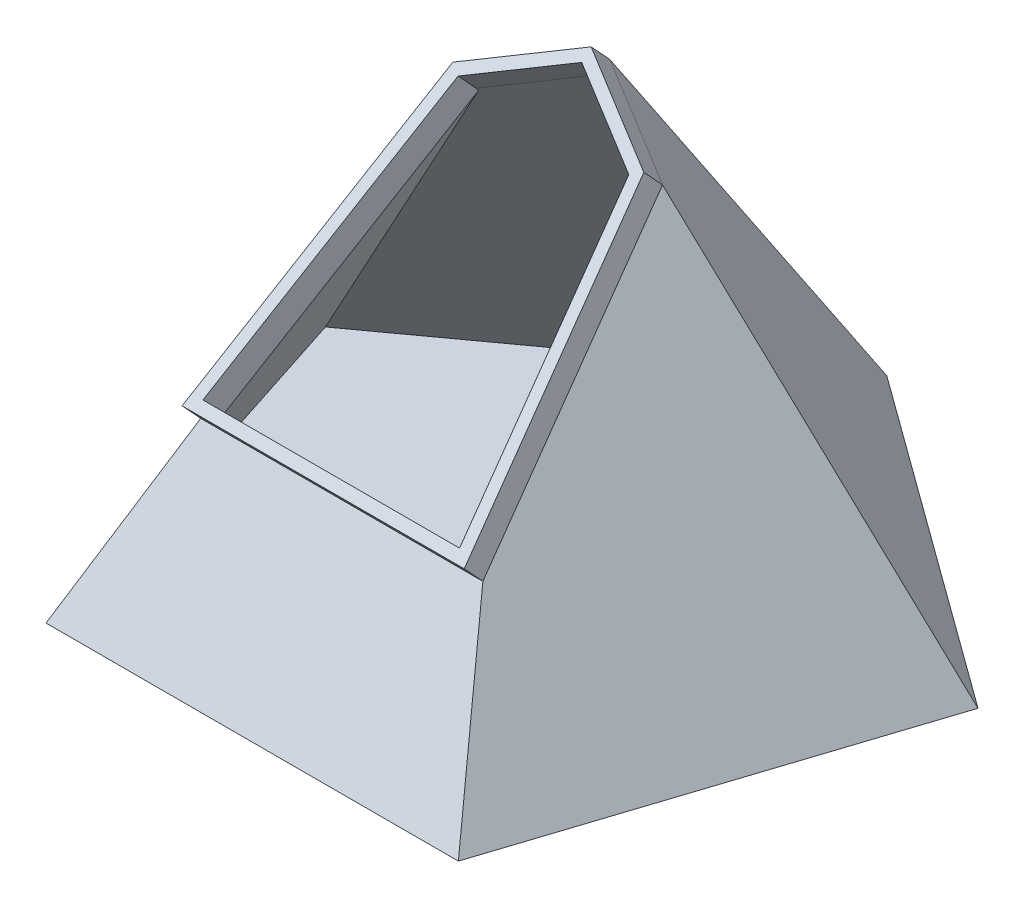
ISO-10303-21;
HEADER;
FILE_DESCRIPTION(('STEP AP214'),'2;1');
FILE_NAME('part.step','',(''),(''),'','','');
FILE_SCHEMA(('AUTOMOTIVE_DESIGN { 1 0 10303 214 1 1 1 1 }'));
ENDSEC;
DATA;
#1=APPLICATION_CONTEXT('core data for automotive mechanical design processes');
#2=APPLICATION_PROTOCOL_DEFINITION('international standard','automotive_design',2000,#1);
#3=PRODUCT_CONTEXT('',#1,'mechanical');
#4=PRODUCT('Part','Part','',(#3));
#5=PRODUCT_RELATED_PRODUCT_CATEGORY('part','',(#4));
#6=PRODUCT_DEFINITION_FORMATION('','',#4);
#7=PRODUCT_DEFINITION_CONTEXT('part definition',#1,'design');
#8=PRODUCT_DEFINITION('design','',#6,#7);
#9=PRODUCT_DEFINITION_SHAPE('','',#8);
#10=(LENGTH_UNIT() NAMED_UNIT(*) SI_UNIT(.MILLI.,.METRE.));
#11=(NAMED_UNIT(*) PLANE_ANGLE_UNIT() SI_UNIT($,.RADIAN.));
#12=(NAMED_UNIT(*) SI_UNIT($,.STERADIAN.) SOLID_ANGLE_UNIT());
#13=UNCERTAINTY_MEASURE_WITH_UNIT(LENGTH_MEASURE(1.E-05),#10,'distance_accuracy_value','');
#14=(GEOMETRIC_REPRESENTATION_CONTEXT(3) GLOBAL_UNCERTAINTY_ASSIGNED_CONTEXT((#13)) GLOBAL_UNIT_ASSIGNED_CONTEXT((#10,
#11,#12)) REPRESENTATION_CONTEXT('',''));
#15=CARTESIAN_POINT('',(0.,0.,0.));
#16=DIRECTION('',(0.,0.,1.));
#17=DIRECTION('',(1.,0.,0.));
#18=AXIS2_PLACEMENT_3D('',#15,#16,#17);
#19=CARTESIAN_POINT('',(0.,0.,0.));
#20=DIRECTION('',(0.,1.,0.));
#21=DIRECTION('',(0.,0.,1.));
#22=AXIS2_PLACEMENT_3D('',#19,#20,#21);
#23=PLANE('',#22);
#24=DIRECTION('',(1.,0.,0.));
#25=VECTOR('',#24,1.);
#26=CARTESIAN_POINT('',(-37.5,0.,51.614322017669));
#27=LINE('',#26,#25);
#28=CARTESIAN_POINT('',(-37.5,0.,51.614322017669));
#29=VERTEX_POINT('',#28);
#30=CARTESIAN_POINT('',(37.5,0.,51.614322017669));
#31=VERTEX_POINT('',#30);
#32=EDGE_CURVE('E285',#29,#31,#27,.T.);
#33=ORIENTED_EDGE('',*,*,#32,.F.);
#34=DIRECTION('',(0.309016994374948,0.,0.951056516295153));
#35=VECTOR('',#34,1.);
#36=CARTESIAN_POINT('',(-60.6762745781211,0.,-19.7149167044675));
#37=LINE('',#36,#35);
#38=CARTESIAN_POINT('',(-60.6762745781211,0.,-19.7149167044675));
#39=VERTEX_POINT('',#38);
#40=EDGE_CURVE('E290',#39,#29,#37,.T.);
#41=ORIENTED_EDGE('',*,*,#40,.F.);
#42=DIRECTION('',(-0.809016994374947,0.,0.587785252292474));
#43=VECTOR('',#42,1.);
#44=CARTESIAN_POINT('',(0.,0.,-63.798810626403));
#45=LINE('',#44,#43);
#46=CARTESIAN_POINT('',(0.,0.,-63.798810626403));
#47=VERTEX_POINT('',#46);
#48=EDGE_CURVE('E346',#47,#39,#45,.T.);
#49=ORIENTED_EDGE('',*,*,#48,.F.);
#50=DIRECTION('',(-0.809016994374948,0.,-0.587785252292473));
#51=VECTOR('',#50,1.);
#52=CARTESIAN_POINT('',(60.6762745781211,0.,-19.7149167044675));
#53=LINE('',#52,#51);
#54=CARTESIAN_POINT('',(60.6762745781211,0.,-19.7149167044675));
#55=VERTEX_POINT('',#54);
#56=EDGE_CURVE('E349',#55,#47,#53,.T.);
#57=ORIENTED_EDGE('',*,*,#56,.F.);
#58=DIRECTION('',(0.309016994374948,0.,-0.951056516295154));
#59=VECTOR('',#58,1.);
#60=CARTESIAN_POINT('',(37.5,0.,51.614322017669));
#61=LINE('',#60,#59);
#62=EDGE_CURVE('E366',#31,#55,#61,.T.);
#63=ORIENTED_EDGE('',*,*,#62,.F.);
#64=EDGE_LOOP('',(#33,#41,#49,#57,#63));
#65=FACE_BOUND('',#64,.T.);
#66=ADVANCED_FACE('F46',(#65),#23,.F.);
#67=CARTESIAN_POINT('',(0.,21.6513649291611,39.850948106345));
#68=DIRECTION('',(0.,0.477398266144197,0.878687029312778));
#69=DIRECTION('',(0.,-0.878687029312778,0.477398266144197));
#70=AXIS2_PLACEMENT_3D('',#67,#68,#69);
#71=PLANE('',#70);
#72=DIRECTION('',(1.,0.,0.));
#73=VECTOR('',#72,1.);
#74=CARTESIAN_POINT('',(-50.,30.,35.315062433142));
#75=LINE('',#74,#73);
#76=CARTESIAN_POINT('',(-25.6578947368421,30.,35.315062433142));
#77=VERTEX_POINT('',#76);
#78=CARTESIAN_POINT('',(25.6578947368421,30.,35.3150624331419));
#79=VERTEX_POINT('',#78);
#80=EDGE_CURVE('E269',#77,#79,#75,.T.);
#81=ORIENTED_EDGE('',*,*,#80,.F.);
#82=DIRECTION('',(-0.327697959181855,-0.8301681632607,0.451037546393206));
#83=VECTOR('',#82,1.);
#84=CARTESIAN_POINT('',(0.,95.,0.));
#85=LINE('',#84,#83);
#86=EDGE_CURVE('E338',#77,#29,#85,.T.);
#87=ORIENTED_EDGE('',*,*,#86,.T.);
#88=ORIENTED_EDGE('',*,*,#32,.T.);
#89=DIRECTION('',(0.327697959181855,-0.8301681632607,0.451037546393206));
#90=VECTOR('',#89,1.);
#91=CARTESIAN_POINT('',(0.,95.,0.));
#92=LINE('',#91,#90);
#93=EDGE_CURVE('E51',#79,#31,#92,.T.);
#94=ORIENTED_EDGE('',*,*,#93,.F.);
#95=EDGE_LOOP('',(#81,#87,#88,#94));
#96=FACE_BOUND('',#95,.T.);
#97=ADVANCED_FACE('F381',(#96),#71,.T.);
#98=CARTESIAN_POINT('',(37.9005038770794,21.6513649291611,12.3146202068147));
#99=DIRECTION('',(0.835681025011948,0.477398266144197,0.271529224794486));
#100=DIRECTION('',(-0.496034173352985,0.868302999456999,0.));
#101=AXIS2_PLACEMENT_3D('',#98,#99,#100);
#102=PLANE('',#101);
#103=DIRECTION('',(-0.147132683830162,0.670925038265538,-0.726781649725225));
#104=VECTOR('',#103,1.);
#105=CARTESIAN_POINT('',(24.2875446031351,36.2487966097043,28.5460339280515));
#106=LINE('',#105,#104);
#107=CARTESIAN_POINT('',(17.3662487703551,67.8099056071806,-5.64263627516887));
#108=VERTEX_POINT('',#107);
#109=EDGE_CURVE('E281',#79,#108,#106,.T.);
#110=ORIENTED_EDGE('',*,*,#109,.F.);
#111=ORIENTED_EDGE('',*,*,#93,.T.);
#112=ORIENTED_EDGE('',*,*,#62,.T.);
#113=DIRECTION('',(0.530226436000217,-0.8301681632607,-0.172281012519847));
#114=VECTOR('',#113,1.);
#115=CARTESIAN_POINT('',(0.,95.,0.));
#116=LINE('',#115,#114);
#117=EDGE_CURVE('E58',#108,#55,#116,.T.);
#118=ORIENTED_EDGE('',*,*,#117,.F.);
#119=EDGE_LOOP('',(#110,#111,#112,#118));
#120=FACE_BOUND('',#119,.T.);
#121=ADVANCED_FACE('F308',(#120),#102,.T.);
#122=CARTESIAN_POINT('',(-37.9005038770794,21.6513649291611,12.3146202068147));
#123=DIRECTION('',(-0.835681025011948,0.477398266144197,0.271529224794486));
#124=DIRECTION('',(-0.496034173352985,-0.868302999456999,0.));
#125=AXIS2_PLACEMENT_3D('',#122,#123,#124);
#126=PLANE('',#125);
#127=DIRECTION('',(-0.147132683830162,-0.670925038265538,0.726781649725225));
#128=VECTOR('',#127,1.);
#129=CARTESIAN_POINT('',(-24.287544603135,36.2487966097043,28.5460339280515));
#130=LINE('',#129,#128);
#131=CARTESIAN_POINT('',(-17.3662487703551,67.8099056071806,-5.64263627516887));
#132=VERTEX_POINT('',#131);
#133=EDGE_CURVE('E277',#132,#77,#130,.T.);
#134=ORIENTED_EDGE('',*,*,#133,.F.);
#135=DIRECTION('',(-0.530226436000217,-0.8301681632607,-0.172281012519847));
#136=VECTOR('',#135,1.);
#137=CARTESIAN_POINT('',(0.,95.,0.));
#138=LINE('',#137,#136);
#139=EDGE_CURVE('E333',#132,#39,#138,.T.);
#140=ORIENTED_EDGE('',*,*,#139,.T.);
#141=ORIENTED_EDGE('',*,*,#40,.T.);
#142=ORIENTED_EDGE('',*,*,#86,.F.);
#143=EDGE_LOOP('',(#134,#140,#141,#142));
#144=FACE_BOUND('',#143,.T.);
#145=ADVANCED_FACE('F298',(#144),#126,.T.);
#146=CARTESIAN_POINT('',(-23.4237995867822,21.6513649291611,-32.2400942599872));
#147=DIRECTION('',(-0.516479277210735,0.477398266144197,-0.710872739450875));
#148=DIRECTION('',(-0.809016994374947,0.,0.587785252292474));
#149=AXIS2_PLACEMENT_3D('',#146,#147,#148);
#150=PLANE('',#149);
#151=DIRECTION('',(-0.853558395699013,-0.35339614881803,0.38281748540566));
#152=VECTOR('',#151,1.);
#153=CARTESIAN_POINT('',(-27.0121004182079,63.816263412812,-1.31651085594315));
#154=LINE('',#153,#152);
#155=CARTESIAN_POINT('',(0.,75.,-13.4313285529269));
#156=VERTEX_POINT('',#155);
#157=EDGE_CURVE('E273',#156,#132,#154,.T.);
#158=ORIENTED_EDGE('',*,*,#157,.F.);
#159=DIRECTION('',(0.,-0.8301681632607,-0.557513067746718));
#160=VECTOR('',#159,1.);
#161=CARTESIAN_POINT('',(0.,95.,0.));
#162=LINE('',#161,#160);
#163=EDGE_CURVE('E330',#156,#47,#162,.T.);
#164=ORIENTED_EDGE('',*,*,#163,.T.);
#165=ORIENTED_EDGE('',*,*,#48,.T.);
#166=ORIENTED_EDGE('',*,*,#139,.F.);
#167=EDGE_LOOP('',(#158,#164,#165,#166));
#168=FACE_BOUND('',#167,.T.);
#169=ADVANCED_FACE('F307',(#168),#150,.T.);
#170=CARTESIAN_POINT('',(23.4237995867822,21.6513649291611,-32.2400942599872));
#171=DIRECTION('',(0.516479277210735,0.477398266144197,-0.710872739450875));
#172=DIRECTION('',(-0.809016994374948,0.,-0.587785252292473));
#173=AXIS2_PLACEMENT_3D('',#170,#171,#172);
#174=PLANE('',#173);
#175=DIRECTION('',(-0.853558395699013,0.35339614881803,-0.382817485405659));
#176=VECTOR('',#175,1.);
#177=CARTESIAN_POINT('',(27.0121004182078,63.816263412812,-1.31651085594317));
#178=LINE('',#177,#176);
#179=EDGE_CURVE('E12',#108,#156,#178,.T.);
#180=ORIENTED_EDGE('',*,*,#179,.F.);
#181=ORIENTED_EDGE('',*,*,#117,.T.);
#182=ORIENTED_EDGE('',*,*,#56,.T.);
#183=ORIENTED_EDGE('',*,*,#163,.F.);
#184=EDGE_LOOP('',(#180,#181,#182,#183));
#185=FACE_BOUND('',#184,.T.);
#186=ADVANCED_FACE('F48',(#185),#174,.T.);
#187=CARTESIAN_POINT('',(-25.6578947368421,33.673892082224,38.7065985111119));
#188=DIRECTION('',(0.,0.678307215593986,-0.734778416444804));
#189=DIRECTION('',(0.,0.734778416444804,0.678307215593986));
#190=AXIS2_PLACEMENT_3D('',#187,#188,#189);
#191=PLANE('',#190);
#192=ORIENTED_EDGE('',*,*,#80,.T.);
#193=DIRECTION('',(0.,-0.734778416444804,-0.678307215593986));
#194=VECTOR('',#193,1.);
#195=CARTESIAN_POINT('',(25.6578947368421,33.673892082224,38.7065985111119));
#196=LINE('',#195,#194);
#197=CARTESIAN_POINT('',(25.6578947368421,33.673892082224,38.7065985111119));
#198=VERTEX_POINT('',#197);
#199=EDGE_CURVE('E265',#198,#79,#196,.T.);
#200=ORIENTED_EDGE('',*,*,#199,.F.);
#201=DIRECTION('',(1.,0.,0.));
#202=VECTOR('',#201,1.);
#203=CARTESIAN_POINT('',(-25.6578947368421,33.673892082224,38.7065985111119));
#204=LINE('',#203,#202);
#205=CARTESIAN_POINT('',(-25.6578947368421,33.673892082224,38.7065985111119));
#206=VERTEX_POINT('',#205);
#207=EDGE_CURVE('E217',#206,#198,#204,.T.);
#208=ORIENTED_EDGE('',*,*,#207,.F.);
#209=DIRECTION('',(0.,-0.734778416444804,-0.678307215593986));
#210=VECTOR('',#209,1.);
#211=CARTESIAN_POINT('',(-25.6578947368421,33.673892082224,38.7065985111119));
#212=LINE('',#211,#210);
#213=EDGE_CURVE('E249',#206,#77,#212,.T.);
#214=ORIENTED_EDGE('',*,*,#213,.T.);
#215=EDGE_LOOP('',(#192,#200,#208,#214));
#216=FACE_BOUND('',#215,.T.);
#217=ADVANCED_FACE('F382',(#216),#191,.F.);
#218=CARTESIAN_POINT('',(25.6578947368421,33.673892082224,38.7065985111119));
#219=DIRECTION('',(-0.989116764264429,-0.0998011610917075,0.108109920432));
#220=DIRECTION('',(0.10865237817571,0.,0.994079806009941));
#221=AXIS2_PLACEMENT_3D('',#218,#219,#220);
#222=PLANE('',#221);
#223=ORIENTED_EDGE('',*,*,#109,.T.);
#224=DIRECTION('',(0.,-0.734778416444804,-0.678307215593986));
#225=VECTOR('',#224,1.);
#226=CARTESIAN_POINT('',(17.3662487703551,71.4837976894047,-2.25110019719893));
#227=LINE('',#226,#225);
#228=CARTESIAN_POINT('',(17.3662487703551,71.4837976894047,-2.25110019719893));
#229=VERTEX_POINT('',#228);
#230=EDGE_CURVE('E261',#229,#108,#227,.T.);
#231=ORIENTED_EDGE('',*,*,#230,.F.);
#232=DIRECTION('',(-0.147132683830162,0.670925038265538,-0.726781649725225));
#233=VECTOR('',#232,1.);
#234=CARTESIAN_POINT('',(25.6578947368421,33.673892082224,38.7065985111119));
#235=LINE('',#234,#233);
#236=EDGE_CURVE('E237',#198,#229,#235,.T.);
#237=ORIENTED_EDGE('',*,*,#236,.F.);
#238=ORIENTED_EDGE('',*,*,#199,.T.);
#239=EDGE_LOOP('',(#223,#231,#237,#238));
#240=FACE_BOUND('',#239,.T.);
#241=ADVANCED_FACE('F431',(#240),#222,.F.);
#242=CARTESIAN_POINT('',(17.3662487703551,71.4837976894047,-2.25110019719893));
#243=DIRECTION('',(-0.520997183420148,-0.578974818733467,0.627176286334888));
#244=DIRECTION('',(0.,-0.734778416444804,-0.678307215593986));
#245=AXIS2_PLACEMENT_3D('',#242,#243,#244);
#246=PLANE('',#245);
#247=ORIENTED_EDGE('',*,*,#179,.T.);
#248=DIRECTION('',(0.,-0.734778416444804,-0.678307215593986));
#249=VECTOR('',#248,1.);
#250=CARTESIAN_POINT('',(0.,78.673892082224,-10.039792474957));
#251=LINE('',#250,#249);
#252=CARTESIAN_POINT('',(0.,78.673892082224,-10.039792474957));
#253=VERTEX_POINT('',#252);
#254=EDGE_CURVE('E257',#253,#156,#251,.T.);
#255=ORIENTED_EDGE('',*,*,#254,.F.);
#256=DIRECTION('',(-0.853558395699013,0.35339614881803,-0.382817485405659));
#257=VECTOR('',#256,1.);
#258=CARTESIAN_POINT('',(17.3662487703551,71.4837976894047,-2.25110019719893));
#259=LINE('',#258,#257);
#260=EDGE_CURVE('E240',#229,#253,#259,.T.);
#261=ORIENTED_EDGE('',*,*,#260,.F.);
#262=ORIENTED_EDGE('',*,*,#230,.T.);
#263=EDGE_LOOP('',(#247,#255,#261,#262));
#264=FACE_BOUND('',#263,.T.);
#265=ADVANCED_FACE('F447',(#264),#246,.F.);
#266=CARTESIAN_POINT('',(0.,78.673892082224,-10.039792474957));
#267=DIRECTION('',(0.520997183420148,-0.578974818733467,0.627176286334888));
#268=DIRECTION('',(0.,-0.734778416444804,-0.678307215593986));
#269=AXIS2_PLACEMENT_3D('',#266,#267,#268);
#270=PLANE('',#269);
#271=ORIENTED_EDGE('',*,*,#157,.T.);
#272=DIRECTION('',(0.,-0.734778416444804,-0.678307215593986));
#273=VECTOR('',#272,1.);
#274=CARTESIAN_POINT('',(-17.3662487703551,71.4837976894047,-2.25110019719893));
#275=LINE('',#274,#273);
#276=CARTESIAN_POINT('',(-17.3662487703551,71.4837976894047,-2.25110019719893));
#277=VERTEX_POINT('',#276);
#278=EDGE_CURVE('E253',#277,#132,#275,.T.);
#279=ORIENTED_EDGE('',*,*,#278,.F.);
#280=DIRECTION('',(-0.853558395699013,-0.35339614881803,0.382817485405659));
#281=VECTOR('',#280,1.);
#282=CARTESIAN_POINT('',(0.,78.673892082224,-10.039792474957));
#283=LINE('',#282,#281);
#284=EDGE_CURVE('E243',#253,#277,#283,.T.);
#285=ORIENTED_EDGE('',*,*,#284,.F.);
#286=ORIENTED_EDGE('',*,*,#254,.T.);
#287=EDGE_LOOP('',(#271,#279,#285,#286));
#288=FACE_BOUND('',#287,.T.);
#289=ADVANCED_FACE('F442',(#288),#270,.F.);
#290=CARTESIAN_POINT('',(-17.3662487703551,71.4837976894047,-2.25110019719893));
#291=DIRECTION('',(0.989116764264429,-0.0998011610917073,0.108109920432));
#292=DIRECTION('',(0.10865237817571,0.,-0.994079806009941));
#293=AXIS2_PLACEMENT_3D('',#290,#291,#292);
#294=PLANE('',#293);
#295=ORIENTED_EDGE('',*,*,#133,.T.);
#296=ORIENTED_EDGE('',*,*,#213,.F.);
#297=DIRECTION('',(-0.147132683830162,-0.670925038265538,0.726781649725225));
#298=VECTOR('',#297,1.);
#299=CARTESIAN_POINT('',(-17.3662487703551,71.4837976894047,-2.25110019719893));
#300=LINE('',#299,#298);
#301=EDGE_CURVE('E246',#277,#206,#300,.T.);
#302=ORIENTED_EDGE('',*,*,#301,.F.);
#303=ORIENTED_EDGE('',*,*,#278,.T.);
#304=EDGE_LOOP('',(#295,#296,#302,#303));
#305=FACE_BOUND('',#304,.T.);
#306=ADVANCED_FACE('F438',(#305),#294,.F.);
#307=CARTESIAN_POINT('',(0.,37.4720931312899,34.5921853248572));
#308=DIRECTION('',(0.,0.734778416444804,0.678307215593986));
#309=DIRECTION('',(0.,-0.678307215593986,0.734778416444804));
#310=AXIS2_PLACEMENT_3D('',#307,#308,#309);
#311=PLANE('',#310);
#312=DIRECTION('',(1.,0.,0.));
#313=VECTOR('',#312,1.);
#314=CARTESIAN_POINT('',(-25.6578947368421,35.030506513412,37.2370416782223));
#315=LINE('',#314,#313);
#316=CARTESIAN_POINT('',(-23.3383856045037,35.030506513412,37.2370416782223));
#317=VERTEX_POINT('',#316);
#318=CARTESIAN_POINT('',(23.3383856045038,35.030506513412,37.2370416782223));
#319=VERTEX_POINT('',#318);
#320=EDGE_CURVE('E218',#317,#319,#315,.T.);
#321=ORIENTED_EDGE('',*,*,#320,.F.);
#322=DIRECTION('',(-0.147132683830162,-0.670925038265538,0.726781649725225));
#323=VECTOR('',#322,1.);
#324=CARTESIAN_POINT('',(-15.3880152418263,71.2841953672213,-2.03488035633492));
#325=LINE('',#324,#323);
#326=CARTESIAN_POINT('',(-15.5256714909766,70.6564828710959,-1.35490882826903));
#327=VERTEX_POINT('',#326);
#328=EDGE_CURVE('E230',#327,#317,#325,.T.);
#329=ORIENTED_EDGE('',*,*,#328,.F.);
#330=DIRECTION('',(-0.853558395699013,-0.35339614881803,0.382817485405659));
#331=VECTOR('',#330,1.);
#332=CARTESIAN_POINT('',(1.0419943668403,77.5159424447571,-8.78543990228722));
#333=LINE('',#332,#331);
#334=CARTESIAN_POINT('',(0.,77.0845287322484,-8.31810964658282));
#335=VERTEX_POINT('',#334);
#336=EDGE_CURVE('E227',#335,#327,#333,.T.);
#337=ORIENTED_EDGE('',*,*,#336,.F.);
#338=DIRECTION('',(-0.853558395699013,0.35339614881803,-0.382817485405659));
#339=VECTOR('',#338,1.);
#340=CARTESIAN_POINT('',(16.3242544035148,70.3258480519378,-0.996747624529149));
#341=LINE('',#340,#339);
#342=CARTESIAN_POINT('',(15.5256714909766,70.6564828710959,-1.35490882826903));
#343=VERTEX_POINT('',#342);
#344=EDGE_CURVE('E224',#343,#335,#341,.T.);
#345=ORIENTED_EDGE('',*,*,#344,.F.);
#346=DIRECTION('',(-0.147132683830162,0.670925038265538,-0.726781649725225));
#347=VECTOR('',#346,1.);
#348=CARTESIAN_POINT('',(23.6796612083133,33.4742897600406,38.9228183519759));
#349=LINE('',#348,#347);
#350=EDGE_CURVE('E221',#319,#343,#349,.T.);
#351=ORIENTED_EDGE('',*,*,#350,.F.);
#352=EDGE_LOOP('',(#321,#329,#337,#345,#351));
#353=FACE_BOUND('',#352,.T.);
#354=ORIENTED_EDGE('',*,*,#207,.T.);
#355=ORIENTED_EDGE('',*,*,#236,.T.);
#356=ORIENTED_EDGE('',*,*,#260,.T.);
#357=ORIENTED_EDGE('',*,*,#284,.T.);
#358=ORIENTED_EDGE('',*,*,#301,.T.);
#359=EDGE_LOOP('',(#354,#355,#356,#357,#358));
#360=FACE_BOUND('',#359,.T.);
#361=ADVANCED_FACE('F449',(#353,#360),#311,.T.);
#362=CARTESIAN_POINT('',(0.,2.,0.));
#363=DIRECTION('',(0.,1.,0.));
#364=DIRECTION('',(0.,0.,1.));
#365=AXIS2_PLACEMENT_3D('',#362,#363,#364);
#366=PLANE('',#365);
#367=DIRECTION('',(1.,0.,0.));
#368=VECTOR('',#367,1.);
#369=CARTESIAN_POINT('',(0.,2.,48.2515814357358));
#370=LINE('',#369,#368);
#371=CARTESIAN_POINT('',(-35.056825956576,2.,48.2515814357359));
#372=VERTEX_POINT('',#371);
#373=CARTESIAN_POINT('',(35.0568259565761,2.,48.2515814357358));
#374=VERTEX_POINT('',#373);
#375=EDGE_CURVE('E676',#372,#374,#370,.T.);
#376=ORIENTED_EDGE('',*,*,#375,.T.);
#377=DIRECTION('',(0.309016994374948,0.,-0.951056516295154));
#378=VECTOR('',#377,1.);
#379=CARTESIAN_POINT('',(45.8899809460029,2.,14.9105586691091));
#380=LINE('',#379,#378);
#381=CARTESIAN_POINT('',(56.7231359354296,2.,-18.4304640975176));
#382=VERTEX_POINT('',#381);
#383=EDGE_CURVE('E189',#374,#382,#380,.T.);
#384=ORIENTED_EDGE('',*,*,#383,.T.);
#385=DIRECTION('',(-0.809016994374948,0.,-0.587785252292473));
#386=VECTOR('',#385,1.);
#387=CARTESIAN_POINT('',(28.3615679677148,2.,-39.036349386977));
#388=LINE('',#387,#386);
#389=CARTESIAN_POINT('',(0.,2.,-59.6422346764364));
#390=VERTEX_POINT('',#389);
#391=EDGE_CURVE('E681',#382,#390,#388,.T.);
#392=ORIENTED_EDGE('',*,*,#391,.T.);
#393=DIRECTION('',(-0.809016994374947,0.,0.587785252292473));
#394=VECTOR('',#393,1.);
#395=CARTESIAN_POINT('',(-28.3615679677148,2.,-39.036349386977));
#396=LINE('',#395,#394);
#397=CARTESIAN_POINT('',(-56.7231359354296,2.,-18.4304640975176));
#398=VERTEX_POINT('',#397);
#399=EDGE_CURVE('E685',#390,#398,#396,.T.);
#400=ORIENTED_EDGE('',*,*,#399,.T.);
#401=DIRECTION('',(0.309016994374948,0.,0.951056516295154));
#402=VECTOR('',#401,1.);
#403=CARTESIAN_POINT('',(-45.8899809460028,2.,14.9105586691091));
#404=LINE('',#403,#402);
#405=EDGE_CURVE('E647',#398,#372,#404,.T.);
#406=ORIENTED_EDGE('',*,*,#405,.T.);
#407=EDGE_LOOP('',(#376,#384,#392,#400,#406));
#408=FACE_BOUND('',#407,.T.);
#409=ADVANCED_FACE('F451',(#408),#366,.T.);
#410=CARTESIAN_POINT('',(0.,20.6965683968727,38.0935740477194));
#411=DIRECTION('',(0.,0.477398266144197,0.878687029312778));
#412=DIRECTION('',(0.,-0.878687029312778,0.477398266144197));
#413=AXIS2_PLACEMENT_3D('',#410,#411,#412);
#414=PLANE('',#413);
#415=DIRECTION('',(1.,0.,0.));
#416=VECTOR('',#415,1.);
#417=CARTESIAN_POINT('',(-25.6578947368421,30.3039889213192,32.8737793455306));
#418=LINE('',#417,#416);
#419=CARTESIAN_POINT('',(-23.8841987507922,30.3039889213192,32.8737793455306));
#420=VERTEX_POINT('',#419);
#421=CARTESIAN_POINT('',(23.8841987507922,30.3039889213192,32.8737793455306));
#422=VERTEX_POINT('',#421);
#423=EDGE_CURVE('E169',#420,#422,#418,.T.);
#424=ORIENTED_EDGE('',*,*,#423,.T.);
#425=DIRECTION('',(0.327697959181855,-0.8301681632607,0.451037546393206));
#426=VECTOR('',#425,1.);
#427=CARTESIAN_POINT('',(24.7045233670797,28.2258332267243,34.0028593163061));
#428=LINE('',#427,#426);
#429=EDGE_CURVE('E173',#422,#374,#428,.T.);
#430=ORIENTED_EDGE('',*,*,#429,.T.);
#431=ORIENTED_EDGE('',*,*,#375,.F.);
#432=DIRECTION('',(-0.327697959181855,-0.8301681632607,0.451037546393206));
#433=VECTOR('',#432,1.);
#434=CARTESIAN_POINT('',(-24.7045233670796,28.2258332267242,34.0028593163061));
#435=LINE('',#434,#433);
#436=EDGE_CURVE('E175',#420,#372,#435,.T.);
#437=ORIENTED_EDGE('',*,*,#436,.F.);
#438=EDGE_LOOP('',(#424,#430,#431,#437));
#439=FACE_BOUND('',#438,.T.);
#440=ADVANCED_FACE('F171',(#439),#414,.F.);
#441=CARTESIAN_POINT('',(36.2291418270555,20.6965683968727,11.7715617572258));
#442=DIRECTION('',(0.835681025011948,0.477398266144197,0.271529224794486));
#443=DIRECTION('',(-0.496034173352985,0.868302999456999,0.));
#444=AXIS2_PLACEMENT_3D('',#441,#442,#443);
#445=PLANE('',#444);
#446=DIRECTION('',(-0.147132683830162,0.670925038265538,-0.726781649725225));
#447=VECTOR('',#446,1.);
#448=CARTESIAN_POINT('',(23.6796612083133,29.374267512644,35.1379022299685));
#449=LINE('',#448,#447);
#450=CARTESIAN_POINT('',(23.3383856045038,30.9304842660154,33.4521255562149));
#451=VERTEX_POINT('',#450);
#452=CARTESIAN_POINT('',(15.5437601051169,66.4739765432192,-5.05047381167174));
#453=VERTEX_POINT('',#452);
#454=EDGE_CURVE('E643',#451,#453,#449,.T.);
#455=ORIENTED_EDGE('',*,*,#454,.T.);
#456=DIRECTION('',(0.530226436000218,-0.8301681632607,-0.172281012519847));
#457=VECTOR('',#456,1.);
#458=CARTESIAN_POINT('',(39.9727584838009,28.2258332267243,-12.9879365441479));
#459=LINE('',#458,#457);
#460=EDGE_CURVE('E206',#453,#382,#459,.T.);
#461=ORIENTED_EDGE('',*,*,#460,.T.);
#462=ORIENTED_EDGE('',*,*,#383,.F.);
#463=ORIENTED_EDGE('',*,*,#429,.F.);
#464=DIRECTION('',(0.539144006792832,-0.618840371789193,-0.571279558695376));
#465=VECTOR('',#464,1.);
#466=CARTESIAN_POINT('',(6.56262038987827,50.1860461412607,51.2278063165336));
#467=LINE('',#466,#465);
#468=EDGE_CURVE('E186',#451,#422,#467,.T.);
#469=ORIENTED_EDGE('',*,*,#468,.F.);
#470=EDGE_LOOP('',(#455,#461,#462,#463,#469));
#471=FACE_BOUND('',#470,.T.);
#472=ADVANCED_FACE('F185',(#471),#445,.F.);
#473=CARTESIAN_POINT('',(-36.2291418270555,20.6965683968727,11.7715617572258));
#474=DIRECTION('',(-0.835681025011948,0.477398266144197,0.271529224794486));
#475=DIRECTION('',(-0.496034173352985,-0.868302999456999,0.));
#476=AXIS2_PLACEMENT_3D('',#473,#474,#475);
#477=PLANE('',#476);
#478=DIRECTION('',(-0.147132683830162,-0.670925038265538,0.726781649725225));
#479=VECTOR('',#478,1.);
#480=CARTESIAN_POINT('',(-15.3880152418263,67.1841731198246,-5.81979647834235));
#481=LINE('',#480,#479);
#482=CARTESIAN_POINT('',(-15.5437601051169,66.4739765432192,-5.05047381167175));
#483=VERTEX_POINT('',#482);
#484=CARTESIAN_POINT('',(-23.3383856045037,30.9304842660153,33.4521255562149));
#485=VERTEX_POINT('',#484);
#486=EDGE_CURVE('E639',#483,#485,#481,.T.);
#487=ORIENTED_EDGE('',*,*,#486,.T.);
#488=DIRECTION('',(0.539144006792832,0.618840371789193,0.571279558695376));
#489=VECTOR('',#488,1.);
#490=CARTESIAN_POINT('',(-21.4789021561474,33.0648368954027,35.4224430787957));
#491=LINE('',#490,#489);
#492=EDGE_CURVE('E198',#420,#485,#491,.T.);
#493=ORIENTED_EDGE('',*,*,#492,.F.);
#494=ORIENTED_EDGE('',*,*,#436,.T.);
#495=ORIENTED_EDGE('',*,*,#405,.F.);
#496=DIRECTION('',(-0.530226436000217,-0.8301681632607,-0.172281012519847));
#497=VECTOR('',#496,1.);
#498=CARTESIAN_POINT('',(-39.9727584838009,28.2258332267242,-12.9879365441479));
#499=LINE('',#498,#497);
#500=EDGE_CURVE('E192',#483,#398,#499,.T.);
#501=ORIENTED_EDGE('',*,*,#500,.F.);
#502=EDGE_LOOP('',(#487,#493,#494,#495,#501));
#503=FACE_BOUND('',#502,.T.);
#504=ADVANCED_FACE('F559',(#503),#477,.F.);
#505=CARTESIAN_POINT('',(-22.3908410323608,20.6965683968727,-30.8183487810854));
#506=DIRECTION('',(-0.516479277210735,0.477398266144197,-0.710872739450875));
#507=DIRECTION('',(-0.809016994374947,0.,0.587785252292474));
#508=AXIS2_PLACEMENT_3D('',#505,#506,#507);
#509=PLANE('',#508);
#510=DIRECTION('',(-0.853558395699013,-0.353396148818023,0.382817485405665));
#511=VECTOR('',#510,1.);
#512=CARTESIAN_POINT('',(-25.9701060513672,62.7552901324596,0.0273649815645503));
#513=LINE('',#512,#511);
#514=CARTESIAN_POINT('',(0.,73.5076130071387,-11.6201224597148));
#515=VERTEX_POINT('',#514);
#516=CARTESIAN_POINT('',(-15.5256714909766,67.0795671459862,-4.65692164140093));
#517=VERTEX_POINT('',#516);
#518=EDGE_CURVE('E180',#515,#517,#513,.T.);
#519=ORIENTED_EDGE('',*,*,#518,.T.);
#520=DIRECTION('',(0.0250374814852034,0.838232458646168,0.544737982697075));
#521=VECTOR('',#520,1.);
#522=CARTESIAN_POINT('',(-15.4015800267554,71.234038242155,-1.95707605470605));
#523=LINE('',#522,#521);
#524=EDGE_CURVE('E214',#483,#517,#523,.T.);
#525=ORIENTED_EDGE('',*,*,#524,.F.);
#526=ORIENTED_EDGE('',*,*,#500,.T.);
#527=ORIENTED_EDGE('',*,*,#399,.F.);
#528=DIRECTION('',(0.,-0.8301681632607,-0.557513067746718));
#529=VECTOR('',#528,1.);
#530=CARTESIAN_POINT('',(0.,28.2258332267242,-42.0298455443163));
#531=LINE('',#530,#529);
#532=EDGE_CURVE('E651',#515,#390,#531,.T.);
#533=ORIENTED_EDGE('',*,*,#532,.F.);
#534=EDGE_LOOP('',(#519,#525,#526,#527,#533));
#535=FACE_BOUND('',#534,.T.);
#536=ADVANCED_FACE('F567',(#535),#509,.F.);
#537=CARTESIAN_POINT('',(22.3908410323607,20.6965683968727,-30.8183487810854));
#538=DIRECTION('',(0.516479277210735,0.477398266144197,-0.710872739450875));
#539=DIRECTION('',(-0.809016994374948,0.,-0.587785252292473));
#540=AXIS2_PLACEMENT_3D('',#537,#538,#539);
#541=PLANE('',#540);
#542=DIRECTION('',(-0.853558395699013,0.353396148818029,-0.38281748540566));
#543=VECTOR('',#542,1.);
#544=CARTESIAN_POINT('',(25.9701060513675,62.7552901324594,0.0273649815645954));
#545=LINE('',#544,#543);
#546=CARTESIAN_POINT('',(15.5256714909766,67.0795671459862,-4.65692164140095));
#547=VERTEX_POINT('',#546);
#548=EDGE_CURVE('E199',#547,#515,#545,.T.);
#549=ORIENTED_EDGE('',*,*,#548,.T.);
#550=ORIENTED_EDGE('',*,*,#532,.T.);
#551=ORIENTED_EDGE('',*,*,#391,.F.);
#552=ORIENTED_EDGE('',*,*,#460,.F.);
#553=DIRECTION('',(-0.0250374814852036,0.838232458646168,0.544737982697074));
#554=VECTOR('',#553,1.);
#555=CARTESIAN_POINT('',(16.8602379740297,22.3994764197067,-33.6929512509745));
#556=LINE('',#555,#554);
#557=EDGE_CURVE('E203',#453,#547,#556,.T.);
#558=ORIENTED_EDGE('',*,*,#557,.T.);
#559=EDGE_LOOP('',(#549,#550,#551,#552,#558));
#560=FACE_BOUND('',#559,.T.);
#561=ADVANCED_FACE('F576',(#560),#541,.F.);
#562=CARTESIAN_POINT('',(-25.6578947368421,35.030506513412,37.2370416782223));
#563=DIRECTION('',(0.,0.678307215593986,-0.734778416444804));
#564=DIRECTION('',(0.,0.734778416444804,0.678307215593986));
#565=AXIS2_PLACEMENT_3D('',#562,#563,#564);
#566=PLANE('',#565);
#567=ORIENTED_EDGE('',*,*,#423,.F.);
#568=ORIENTED_EDGE('',*,*,#492,.T.);
#569=DIRECTION('',(0.,-0.734778416444804,-0.678307215593986));
#570=VECTOR('',#569,1.);
#571=CARTESIAN_POINT('',(-23.3383856045037,35.030506513412,37.2370416782223));
#572=LINE('',#571,#570);
#573=EDGE_CURVE('E233',#317,#485,#572,.T.);
#574=ORIENTED_EDGE('',*,*,#573,.F.);
#575=ORIENTED_EDGE('',*,*,#320,.T.);
#576=DIRECTION('',(0.,-0.734778416444804,-0.678307215593986));
#577=VECTOR('',#576,1.);
#578=CARTESIAN_POINT('',(23.3383856045038,35.030506513412,37.2370416782223));
#579=LINE('',#578,#577);
#580=EDGE_CURVE('E181',#319,#451,#579,.T.);
#581=ORIENTED_EDGE('',*,*,#580,.T.);
#582=ORIENTED_EDGE('',*,*,#468,.T.);
#583=EDGE_LOOP('',(#567,#568,#574,#575,#581,#582));
#584=FACE_BOUND('',#583,.T.);
#585=ADVANCED_FACE('F195',(#584),#566,.T.);
#586=CARTESIAN_POINT('',(23.6796612083133,33.4742897600406,38.9228183519759));
#587=DIRECTION('',(-0.989116764264429,-0.0998011610917075,0.108109920432));
#588=DIRECTION('',(0.10865237817571,0.,0.994079806009941));
#589=AXIS2_PLACEMENT_3D('',#586,#587,#588);
#590=PLANE('',#589);
#591=ORIENTED_EDGE('',*,*,#454,.F.);
#592=ORIENTED_EDGE('',*,*,#580,.F.);
#593=ORIENTED_EDGE('',*,*,#350,.T.);
#594=DIRECTION('',(0.,-0.734778416444804,-0.678307215593986));
#595=VECTOR('',#594,1.);
#596=CARTESIAN_POINT('',(15.5256714909766,70.656482871096,-1.35490882826902));
#597=LINE('',#596,#595);
#598=EDGE_CURVE('E659',#343,#547,#597,.T.);
#599=ORIENTED_EDGE('',*,*,#598,.T.);
#600=ORIENTED_EDGE('',*,*,#557,.F.);
#601=EDGE_LOOP('',(#591,#592,#593,#599,#600));
#602=FACE_BOUND('',#601,.T.);
#603=ADVANCED_FACE('F593',(#602),#590,.T.);
#604=CARTESIAN_POINT('',(16.3242544035148,70.3258480519378,-0.996747624529149));
#605=DIRECTION('',(-0.520997183420148,-0.578974818733467,0.627176286334888));
#606=DIRECTION('',(0.,-0.734778416444804,-0.678307215593986));
#607=AXIS2_PLACEMENT_3D('',#604,#605,#606);
#608=PLANE('',#607);
#609=ORIENTED_EDGE('',*,*,#548,.F.);
#610=ORIENTED_EDGE('',*,*,#598,.F.);
#611=ORIENTED_EDGE('',*,*,#344,.T.);
#612=DIRECTION('',(0.,-0.734778416444804,-0.678307215593986));
#613=VECTOR('',#612,1.);
#614=CARTESIAN_POINT('',(0.,77.0845287322484,-8.31810964658282));
#615=LINE('',#614,#613);
#616=EDGE_CURVE('E664',#335,#515,#615,.T.);
#617=ORIENTED_EDGE('',*,*,#616,.T.);
#618=EDGE_LOOP('',(#609,#610,#611,#617));
#619=FACE_BOUND('',#618,.T.);
#620=ADVANCED_FACE('F601',(#619),#608,.T.);
#621=CARTESIAN_POINT('',(1.0419943668403,77.5159424447571,-8.78543990228722));
#622=DIRECTION('',(0.520997183420148,-0.578974818733467,0.627176286334888));
#623=DIRECTION('',(0.,-0.734778416444804,-0.678307215593986));
#624=AXIS2_PLACEMENT_3D('',#621,#622,#623);
#625=PLANE('',#624);
#626=ORIENTED_EDGE('',*,*,#518,.F.);
#627=ORIENTED_EDGE('',*,*,#616,.F.);
#628=ORIENTED_EDGE('',*,*,#336,.T.);
#629=DIRECTION('',(0.,-0.734778416444804,-0.678307215593986));
#630=VECTOR('',#629,1.);
#631=CARTESIAN_POINT('',(-15.5256714909766,70.656482871096,-1.35490882826902));
#632=LINE('',#631,#630);
#633=EDGE_CURVE('E66',#327,#517,#632,.T.);
#634=ORIENTED_EDGE('',*,*,#633,.T.);
#635=EDGE_LOOP('',(#626,#627,#628,#634));
#636=FACE_BOUND('',#635,.T.);
#637=ADVANCED_FACE('F610',(#636),#625,.T.);
#638=CARTESIAN_POINT('',(-15.3880152418263,71.2841953672213,-2.03488035633492));
#639=DIRECTION('',(0.989116764264429,-0.0998011610917073,0.108109920432));
#640=DIRECTION('',(0.10865237817571,0.,-0.994079806009941));
#641=AXIS2_PLACEMENT_3D('',#638,#639,#640);
#642=PLANE('',#641);
#643=ORIENTED_EDGE('',*,*,#486,.F.);
#644=ORIENTED_EDGE('',*,*,#524,.T.);
#645=ORIENTED_EDGE('',*,*,#633,.F.);
#646=ORIENTED_EDGE('',*,*,#328,.T.);
#647=ORIENTED_EDGE('',*,*,#573,.T.);
#648=EDGE_LOOP('',(#643,#644,#645,#646,#647));
#649=FACE_BOUND('',#648,.T.);
#650=ADVANCED_FACE('F463',(#649),#642,.T.);
#651=CLOSED_SHELL('',(#66,#97,#121,#145,#169,#186,#217,#241,#265,#289,#306,#361,#409,#440,#472,
#504,#536,#561,#585,#603,#620,#637,#650));
#652=MANIFOLD_SOLID_BREP('B2',#651);
#653=ADVANCED_BREP_SHAPE_REPRESENTATION('',(#18,#652),#14);
#654=SHAPE_DEFINITION_REPRESENTATION(#9,#653);
ENDSEC;
END-ISO-10303-21;
